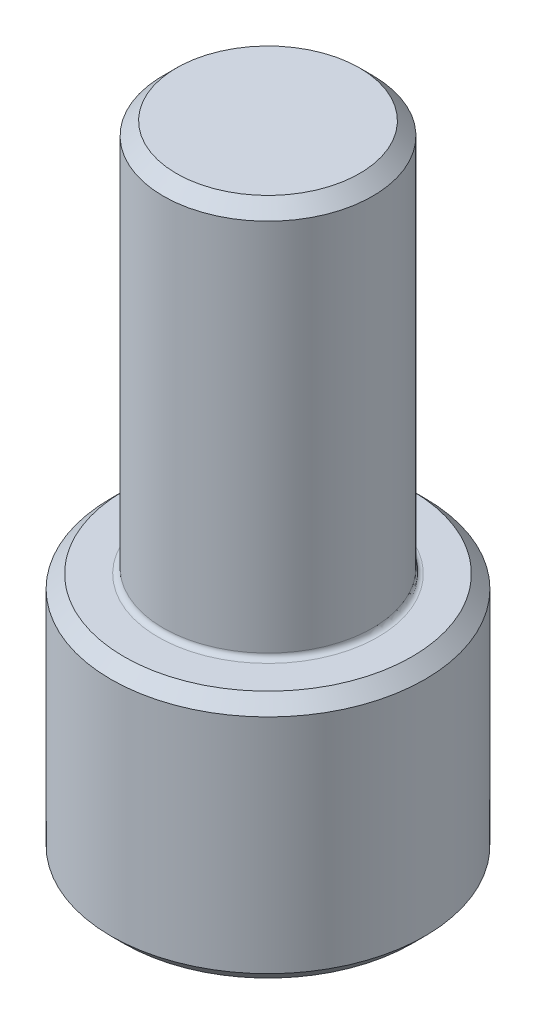
ISO-10303-21;
HEADER;
FILE_DESCRIPTION(('STEP AP214'),'2;1');
FILE_NAME('part.step','',(''),(''),'','','');
FILE_SCHEMA(('AUTOMOTIVE_DESIGN { 1 0 10303 214 1 1 1 1 }'));
ENDSEC;
DATA;
#1=APPLICATION_CONTEXT('core data for automotive mechanical design processes');
#2=APPLICATION_PROTOCOL_DEFINITION('international standard','automotive_design',2000,#1);
#3=PRODUCT_CONTEXT('',#1,'mechanical');
#4=PRODUCT('Part','Part','',(#3));
#5=PRODUCT_RELATED_PRODUCT_CATEGORY('part','',(#4));
#6=PRODUCT_DEFINITION_FORMATION('','',#4);
#7=PRODUCT_DEFINITION_CONTEXT('part definition',#1,'design');
#8=PRODUCT_DEFINITION('design','',#6,#7);
#9=PRODUCT_DEFINITION_SHAPE('','',#8);
#10=(LENGTH_UNIT() NAMED_UNIT(*) SI_UNIT(.MILLI.,.METRE.));
#11=(NAMED_UNIT(*) PLANE_ANGLE_UNIT() SI_UNIT($,.RADIAN.));
#12=(NAMED_UNIT(*) SI_UNIT($,.STERADIAN.) SOLID_ANGLE_UNIT());
#13=UNCERTAINTY_MEASURE_WITH_UNIT(LENGTH_MEASURE(1.E-05),#10,'distance_accuracy_value','');
#14=(GEOMETRIC_REPRESENTATION_CONTEXT(3) GLOBAL_UNCERTAINTY_ASSIGNED_CONTEXT((#13)) GLOBAL_UNIT_ASSIGNED_CONTEXT((#10,
#11,#12)) REPRESENTATION_CONTEXT('',''));
#15=CARTESIAN_POINT('',(0.,0.,0.));
#16=DIRECTION('',(0.,0.,1.));
#17=DIRECTION('',(1.,0.,0.));
#18=AXIS2_PLACEMENT_3D('',#15,#16,#17);
#19=CARTESIAN_POINT('',(0.,0.,0.));
#20=DIRECTION('',(0.,1.,0.));
#21=DIRECTION('',(0.,0.,1.));
#22=AXIS2_PLACEMENT_3D('',#19,#20,#21);
#23=PLANE('',#22);
#24=CARTESIAN_POINT('',(0.,0.,0.));
#25=DIRECTION('',(0.,1.,0.));
#26=DIRECTION('',(0.,0.,1.));
#27=AXIS2_PLACEMENT_3D('',#24,#25,#26);
#28=CIRCLE('',#27,5.49999999999999);
#29=CARTESIAN_POINT('',(0.,0.,5.50000000000002));
#30=VERTEX_POINT('',#29);
#31=EDGE_CURVE('E79',#30,#30,#28,.F.);
#32=ORIENTED_EDGE('',*,*,#31,.T.);
#33=EDGE_LOOP('',(#32));
#34=FACE_BOUND('',#33,.T.);
#35=CARTESIAN_POINT('',(0.,0.,0.));
#36=DIRECTION('',(0.,-1.,0.));
#37=DIRECTION('',(0.,0.,-1.));
#38=AXIS2_PLACEMENT_3D('',#35,#36,#37);
#39=CIRCLE('',#38,1.64999999999999);
#40=CARTESIAN_POINT('',(0.,0.,-1.65));
#41=VERTEX_POINT('',#40);
#42=EDGE_CURVE('E63',#41,#41,#39,.T.);
#43=ORIENTED_EDGE('',*,*,#42,.F.);
#44=EDGE_LOOP('',(#43));
#45=FACE_BOUND('',#44,.T.);
#46=ADVANCED_FACE('F42',(#34,#45),#23,.F.);
#47=CARTESIAN_POINT('',(0.,7.47619047619047,0.));
#48=DIRECTION('',(0.,1.,0.));
#49=DIRECTION('',(0.,0.,1.));
#50=AXIS2_PLACEMENT_3D('',#47,#48,#49);
#51=CYLINDRICAL_SURFACE('',#50,5.99999999999999);
#52=CARTESIAN_POINT('',(0.,0.5,0.));
#53=DIRECTION('',(0.,1.,0.));
#54=DIRECTION('',(0.,0.,1.));
#55=AXIS2_PLACEMENT_3D('',#52,#53,#54);
#56=CIRCLE('',#55,5.99999999999999);
#57=CARTESIAN_POINT('',(0.,0.5,6.00000000000002));
#58=VERTEX_POINT('',#57);
#59=EDGE_CURVE('E76',#58,#58,#56,.T.);
#60=ORIENTED_EDGE('',*,*,#59,.T.);
#61=EDGE_LOOP('',(#60));
#62=FACE_BOUND('',#61,.T.);
#63=CARTESIAN_POINT('',(0.,9.00000000000001,0.));
#64=DIRECTION('',(0.,-1.,0.));
#65=DIRECTION('',(0.,0.,-1.));
#66=AXIS2_PLACEMENT_3D('',#63,#64,#65);
#67=CIRCLE('',#66,5.99999999999999);
#68=CARTESIAN_POINT('',(0.,9.00000000000001,-6.00000000000002));
#69=VERTEX_POINT('',#68);
#70=EDGE_CURVE('E73',#69,#69,#67,.T.);
#71=ORIENTED_EDGE('',*,*,#70,.T.);
#72=EDGE_LOOP('',(#71));
#73=FACE_BOUND('',#72,.T.);
#74=ADVANCED_FACE('F98',(#62,#73),#51,.T.);
#75=CARTESIAN_POINT('',(6.00000000000003,9.50000000000001,0.));
#76=DIRECTION('',(0.,-1.,0.));
#77=DIRECTION('',(0.,0.,-1.));
#78=AXIS2_PLACEMENT_3D('',#75,#76,#77);
#79=PLANE('',#78);
#80=CARTESIAN_POINT('',(0.,9.50000000000001,0.));
#81=DIRECTION('',(0.,-1.,0.));
#82=DIRECTION('',(0.,0.,-1.));
#83=AXIS2_PLACEMENT_3D('',#80,#81,#82);
#84=CIRCLE('',#83,5.49999999999999);
#85=CARTESIAN_POINT('',(0.,9.50000000000001,-5.50000000000001));
#86=VERTEX_POINT('',#85);
#87=EDGE_CURVE('E82',#86,#86,#84,.F.);
#88=ORIENTED_EDGE('',*,*,#87,.T.);
#89=EDGE_LOOP('',(#88));
#90=FACE_BOUND('',#89,.T.);
#91=CARTESIAN_POINT('',(0.,9.50000000000001,0.));
#92=DIRECTION('',(0.,-1.,0.));
#93=DIRECTION('',(0.,0.,-1.));
#94=AXIS2_PLACEMENT_3D('',#91,#92,#93);
#95=CIRCLE('',#94,4.19999999999999);
#96=CARTESIAN_POINT('',(0.,9.50000000000001,-4.20000000000001));
#97=VERTEX_POINT('',#96);
#98=EDGE_CURVE('E66',#97,#97,#95,.T.);
#99=ORIENTED_EDGE('',*,*,#98,.T.);
#100=EDGE_LOOP('',(#99));
#101=FACE_BOUND('',#100,.T.);
#102=ADVANCED_FACE('F104',(#90,#101),#79,.F.);
#103=CARTESIAN_POINT('',(0.,7.47619047619047,0.));
#104=DIRECTION('',(0.,1.,0.));
#105=DIRECTION('',(0.,0.,1.));
#106=AXIS2_PLACEMENT_3D('',#103,#104,#105);
#107=CYLINDRICAL_SURFACE('',#106,3.99999999999999);
#108=CARTESIAN_POINT('',(0.,24.,0.));
#109=DIRECTION('',(0.,-1.,0.));
#110=DIRECTION('',(0.,0.,-1.));
#111=AXIS2_PLACEMENT_3D('',#108,#109,#110);
#112=CIRCLE('',#111,3.99999999999999);
#113=CARTESIAN_POINT('',(0.,24.,-4.00000000000001));
#114=VERTEX_POINT('',#113);
#115=EDGE_CURVE('E11',#114,#114,#112,.T.);
#116=ORIENTED_EDGE('',*,*,#115,.T.);
#117=EDGE_LOOP('',(#116));
#118=FACE_BOUND('',#117,.T.);
#119=CARTESIAN_POINT('',(0.,9.69999999999999,0.));
#120=DIRECTION('',(0.,-1.,0.));
#121=DIRECTION('',(0.,0.,-1.));
#122=AXIS2_PLACEMENT_3D('',#119,#120,#121);
#123=CIRCLE('',#122,3.99999999999999);
#124=CARTESIAN_POINT('',(0.,9.69999999999999,-4.00000000000001));
#125=VERTEX_POINT('',#124);
#126=EDGE_CURVE('E62',#125,#125,#123,.F.);
#127=ORIENTED_EDGE('',*,*,#126,.T.);
#128=EDGE_LOOP('',(#127));
#129=FACE_BOUND('',#128,.T.);
#130=ADVANCED_FACE('F128',(#118,#129),#107,.T.);
#131=CARTESIAN_POINT('',(3.99999999999998,24.5,0.));
#132=DIRECTION('',(0.,-1.,0.));
#133=DIRECTION('',(0.,0.,-1.));
#134=AXIS2_PLACEMENT_3D('',#131,#132,#133);
#135=PLANE('',#134);
#136=CARTESIAN_POINT('',(0.,24.5,0.));
#137=DIRECTION('',(0.,-1.,0.));
#138=DIRECTION('',(0.,0.,-1.));
#139=AXIS2_PLACEMENT_3D('',#136,#137,#138);
#140=CIRCLE('',#139,3.49999999999999);
#141=CARTESIAN_POINT('',(0.,24.5,-3.5));
#142=VERTEX_POINT('',#141);
#143=EDGE_CURVE('E49',#142,#142,#140,.F.);
#144=ORIENTED_EDGE('',*,*,#143,.T.);
#145=EDGE_LOOP('',(#144));
#146=FACE_BOUND('',#145,.T.);
#147=ADVANCED_FACE('F56',(#146),#135,.F.);
#148=CARTESIAN_POINT('',(0.,10.1,0.));
#149=DIRECTION('',(0.,-1.,0.));
#150=DIRECTION('',(0.,0.,-1.));
#151=AXIS2_PLACEMENT_3D('',#148,#149,#150);
#152=CONICAL_SURFACE('',#151,1.65,1.02974425867665);
#153=CARTESIAN_POINT('',(0.,11.0914200213955,0.));
#154=VERTEX_POINT('',#153);
#155=VERTEX_LOOP('',#154);
#156=FACE_BOUND('',#155,.T.);
#157=CARTESIAN_POINT('',(0.,10.1,0.));
#158=DIRECTION('',(0.,-1.,0.));
#159=DIRECTION('',(0.,0.,-1.));
#160=AXIS2_PLACEMENT_3D('',#157,#158,#159);
#161=CIRCLE('',#160,1.65);
#162=CARTESIAN_POINT('',(0.,10.1,-1.65));
#163=VERTEX_POINT('',#162);
#164=EDGE_CURVE('E60',#163,#163,#161,.T.);
#165=ORIENTED_EDGE('',*,*,#164,.T.);
#166=EDGE_LOOP('',(#165));
#167=FACE_BOUND('',#166,.T.);
#168=ADVANCED_FACE('F52',(#156,#167),#152,.F.);
#169=CARTESIAN_POINT('',(0.,0.,0.));
#170=DIRECTION('',(0.,-1.,0.));
#171=DIRECTION('',(0.,0.,-1.));
#172=AXIS2_PLACEMENT_3D('',#169,#170,#171);
#173=CYLINDRICAL_SURFACE('',#172,1.64999999999999);
#174=ORIENTED_EDGE('',*,*,#164,.F.);
#175=EDGE_LOOP('',(#174));
#176=FACE_BOUND('',#175,.T.);
#177=ORIENTED_EDGE('',*,*,#42,.T.);
#178=EDGE_LOOP('',(#177));
#179=FACE_BOUND('',#178,.T.);
#180=ADVANCED_FACE('F55',(#176,#179),#173,.F.);
#181=CARTESIAN_POINT('',(0.,9.69999999999999,0.));
#182=DIRECTION('',(0.,-1.,0.));
#183=DIRECTION('',(0.,0.,-1.));
#184=AXIS2_PLACEMENT_3D('',#181,#182,#183);
#185=TOROIDAL_SURFACE('',#184,4.19999999999999,0.2);
#186=ORIENTED_EDGE('',*,*,#98,.F.);
#187=EDGE_LOOP('',(#186));
#188=FACE_BOUND('',#187,.T.);
#189=ORIENTED_EDGE('',*,*,#126,.F.);
#190=EDGE_LOOP('',(#189));
#191=FACE_BOUND('',#190,.T.);
#192=ADVANCED_FACE('F110',(#188,#191),#185,.F.);
#193=CARTESIAN_POINT('',(0.,0.5,0.));
#194=DIRECTION('',(0.,1.,0.));
#195=DIRECTION('',(0.,0.,1.));
#196=AXIS2_PLACEMENT_3D('',#193,#194,#195);
#197=CONICAL_SURFACE('',#196,5.99999999999999,0.785398163397449);
#198=ORIENTED_EDGE('',*,*,#31,.F.);
#199=EDGE_LOOP('',(#198));
#200=FACE_BOUND('',#199,.T.);
#201=ORIENTED_EDGE('',*,*,#59,.F.);
#202=EDGE_LOOP('',(#201));
#203=FACE_BOUND('',#202,.T.);
#204=ADVANCED_FACE('F94',(#200,#203),#197,.T.);
#205=CARTESIAN_POINT('',(0.,9.50000000000001,0.));
#206=DIRECTION('',(0.,-1.,0.));
#207=DIRECTION('',(0.,0.,-1.));
#208=AXIS2_PLACEMENT_3D('',#205,#206,#207);
#209=CONICAL_SURFACE('',#208,5.49999999999999,0.78539816339745);
#210=ORIENTED_EDGE('',*,*,#70,.F.);
#211=EDGE_LOOP('',(#210));
#212=FACE_BOUND('',#211,.T.);
#213=ORIENTED_EDGE('',*,*,#87,.F.);
#214=EDGE_LOOP('',(#213));
#215=FACE_BOUND('',#214,.T.);
#216=ADVANCED_FACE('F89',(#212,#215),#209,.T.);
#217=CARTESIAN_POINT('',(0.,24.5,0.));
#218=DIRECTION('',(0.,-1.,0.));
#219=DIRECTION('',(0.,0.,-1.));
#220=AXIS2_PLACEMENT_3D('',#217,#218,#219);
#221=CONICAL_SURFACE('',#220,3.49999999999999,0.785398163397446);
#222=ORIENTED_EDGE('',*,*,#115,.F.);
#223=EDGE_LOOP('',(#222));
#224=FACE_BOUND('',#223,.T.);
#225=ORIENTED_EDGE('',*,*,#143,.F.);
#226=EDGE_LOOP('',(#225));
#227=FACE_BOUND('',#226,.T.);
#228=ADVANCED_FACE('F44',(#224,#227),#221,.T.);
#229=CLOSED_SHELL('',(#46,#74,#102,#130,#147,#168,#180,#192,#204,#216,#228));
#230=MANIFOLD_SOLID_BREP('B2',#229);
#231=ADVANCED_BREP_SHAPE_REPRESENTATION('',(#18,#230),#14);
#232=SHAPE_DEFINITION_REPRESENTATION(#9,#231);
ENDSEC;
END-ISO-10303-21;
